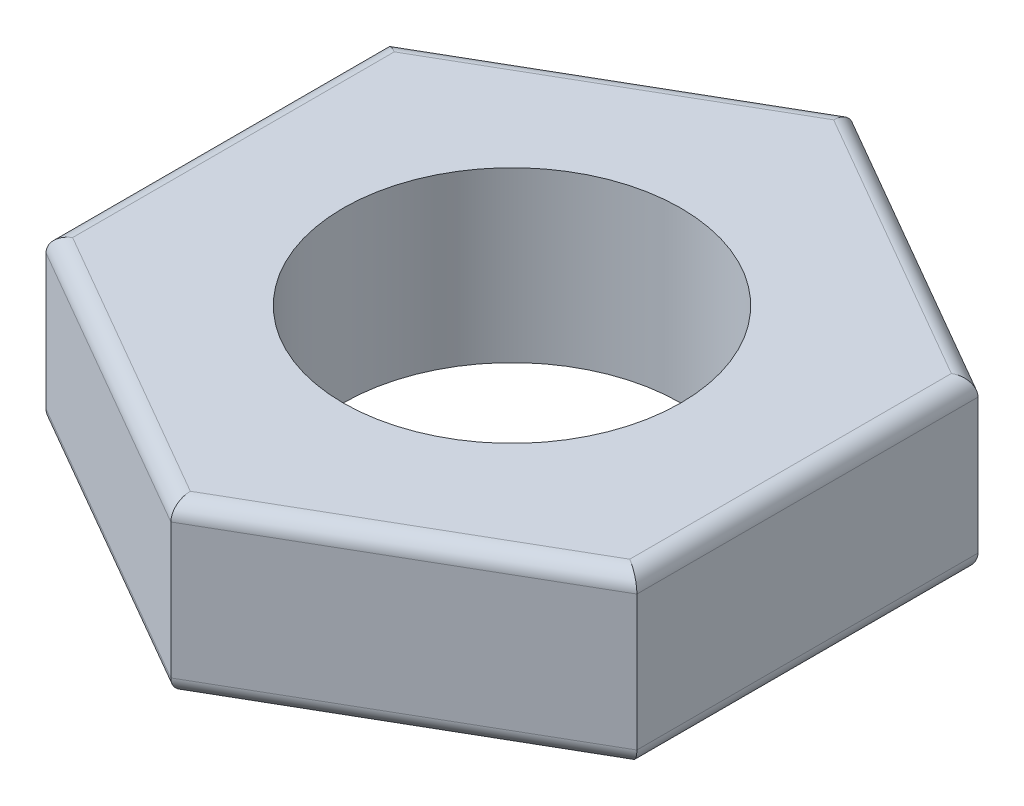
ISO-10303-21;
HEADER;
FILE_DESCRIPTION(('STEP AP214'),'2;1');
FILE_NAME('part.step','',(''),(''),'','','');
FILE_SCHEMA(('AUTOMOTIVE_DESIGN { 1 0 10303 214 1 1 1 1 }'));
ENDSEC;
DATA;
#1=APPLICATION_CONTEXT('core data for automotive mechanical design processes');
#2=APPLICATION_PROTOCOL_DEFINITION('international standard','automotive_design',2000,#1);
#3=PRODUCT_CONTEXT('',#1,'mechanical');
#4=PRODUCT('Part','Part','',(#3));
#5=PRODUCT_RELATED_PRODUCT_CATEGORY('part','',(#4));
#6=PRODUCT_DEFINITION_FORMATION('','',#4);
#7=PRODUCT_DEFINITION_CONTEXT('part definition',#1,'design');
#8=PRODUCT_DEFINITION('design','',#6,#7);
#9=PRODUCT_DEFINITION_SHAPE('','',#8);
#10=(LENGTH_UNIT() NAMED_UNIT(*) SI_UNIT(.MILLI.,.METRE.));
#11=(NAMED_UNIT(*) PLANE_ANGLE_UNIT() SI_UNIT($,.RADIAN.));
#12=(NAMED_UNIT(*) SI_UNIT($,.STERADIAN.) SOLID_ANGLE_UNIT());
#13=UNCERTAINTY_MEASURE_WITH_UNIT(LENGTH_MEASURE(1.E-05),#10,'distance_accuracy_value','');
#14=(GEOMETRIC_REPRESENTATION_CONTEXT(3) GLOBAL_UNCERTAINTY_ASSIGNED_CONTEXT((#13)) GLOBAL_UNIT_ASSIGNED_CONTEXT((#10,
#11,#12)) REPRESENTATION_CONTEXT('',''));
#15=CARTESIAN_POINT('',(0.,0.,0.));
#16=DIRECTION('',(0.,0.,1.));
#17=DIRECTION('',(1.,0.,0.));
#18=AXIS2_PLACEMENT_3D('',#15,#16,#17);
#19=CARTESIAN_POINT('',(3.5,0.,-2.02072594216369));
#20=DIRECTION('',(0.5,0.,-0.866025403784439));
#21=DIRECTION('',(-0.866025403784439,0.,-0.5));
#22=AXIS2_PLACEMENT_3D('',#19,#20,#21);
#23=PLANE('',#22);
#24=DIRECTION('',(0.,1.,0.));
#25=VECTOR('',#24,1.);
#26=CARTESIAN_POINT('',(0.,0.,-4.04145188432738));
#27=LINE('',#26,#25);
#28=CARTESIAN_POINT('',(0.,0.2,-4.04145188432738));
#29=VERTEX_POINT('',#28);
#30=CARTESIAN_POINT('',(0.,1.8,-4.04145188432738));
#31=VERTEX_POINT('',#30);
#32=EDGE_CURVE('E253',#29,#31,#27,.T.);
#33=ORIENTED_EDGE('',*,*,#32,.T.);
#34=DIRECTION('',(-0.866025403784439,0.,-0.5));
#35=VECTOR('',#34,1.);
#36=CARTESIAN_POINT('',(3.5,1.8,-2.02072594216369));
#37=LINE('',#36,#35);
#38=CARTESIAN_POINT('',(3.5,1.8,-2.02072594216369));
#39=VERTEX_POINT('',#38);
#40=EDGE_CURVE('E157',#31,#39,#37,.F.);
#41=ORIENTED_EDGE('',*,*,#40,.T.);
#42=DIRECTION('',(0.,1.,0.));
#43=VECTOR('',#42,1.);
#44=CARTESIAN_POINT('',(3.5,0.,-2.02072594216369));
#45=LINE('',#44,#43);
#46=CARTESIAN_POINT('',(3.5,0.2,-2.02072594216369));
#47=VERTEX_POINT('',#46);
#48=EDGE_CURVE('E154',#47,#39,#45,.T.);
#49=ORIENTED_EDGE('',*,*,#48,.F.);
#50=DIRECTION('',(-0.866025403784439,0.,-0.5));
#51=VECTOR('',#50,1.);
#52=CARTESIAN_POINT('',(0.,0.2,-4.04145188432738));
#53=LINE('',#52,#51);
#54=EDGE_CURVE('E213',#47,#29,#53,.T.);
#55=ORIENTED_EDGE('',*,*,#54,.T.);
#56=EDGE_LOOP('',(#33,#41,#49,#55));
#57=FACE_BOUND('',#56,.T.);
#58=ADVANCED_FACE('F39',(#57),#23,.T.);
#59=CARTESIAN_POINT('',(3.5,0.,2.02072594216369));
#60=DIRECTION('',(1.,0.,0.));
#61=DIRECTION('',(0.,0.,-1.));
#62=AXIS2_PLACEMENT_3D('',#59,#60,#61);
#63=PLANE('',#62);
#64=ORIENTED_EDGE('',*,*,#48,.T.);
#65=DIRECTION('',(0.,0.,-1.));
#66=VECTOR('',#65,1.);
#67=CARTESIAN_POINT('',(3.5,1.8,2.02072594216369));
#68=LINE('',#67,#66);
#69=CARTESIAN_POINT('',(3.5,1.8,2.02072594216369));
#70=VERTEX_POINT('',#69);
#71=EDGE_CURVE('E198',#39,#70,#68,.F.);
#72=ORIENTED_EDGE('',*,*,#71,.T.);
#73=DIRECTION('',(0.,1.,0.));
#74=VECTOR('',#73,1.);
#75=CARTESIAN_POINT('',(3.5,0.,2.02072594216369));
#76=LINE('',#75,#74);
#77=CARTESIAN_POINT('',(3.5,0.2,2.02072594216369));
#78=VERTEX_POINT('',#77);
#79=EDGE_CURVE('E265',#78,#70,#76,.T.);
#80=ORIENTED_EDGE('',*,*,#79,.F.);
#81=DIRECTION('',(0.,0.,-1.));
#82=VECTOR('',#81,1.);
#83=CARTESIAN_POINT('',(3.5,0.2,-2.02072594216369));
#84=LINE('',#83,#82);
#85=EDGE_CURVE('E204',#78,#47,#84,.T.);
#86=ORIENTED_EDGE('',*,*,#85,.T.);
#87=EDGE_LOOP('',(#64,#72,#80,#86));
#88=FACE_BOUND('',#87,.T.);
#89=ADVANCED_FACE('F287',(#88),#63,.T.);
#90=CARTESIAN_POINT('',(0.,0.,4.04145188432738));
#91=DIRECTION('',(0.5,0.,0.866025403784439));
#92=DIRECTION('',(0.866025403784439,0.,-0.5));
#93=AXIS2_PLACEMENT_3D('',#90,#91,#92);
#94=PLANE('',#93);
#95=ORIENTED_EDGE('',*,*,#79,.T.);
#96=DIRECTION('',(0.866025403784439,0.,-0.5));
#97=VECTOR('',#96,1.);
#98=CARTESIAN_POINT('',(0.,1.8,4.04145188432738));
#99=LINE('',#98,#97);
#100=CARTESIAN_POINT('',(0.,1.8,4.04145188432738));
#101=VERTEX_POINT('',#100);
#102=EDGE_CURVE('E239',#70,#101,#99,.F.);
#103=ORIENTED_EDGE('',*,*,#102,.T.);
#104=DIRECTION('',(0.,1.,0.));
#105=VECTOR('',#104,1.);
#106=CARTESIAN_POINT('',(0.,0.,4.04145188432738));
#107=LINE('',#106,#105);
#108=CARTESIAN_POINT('',(0.,0.2,4.04145188432738));
#109=VERTEX_POINT('',#108);
#110=EDGE_CURVE('E263',#109,#101,#107,.T.);
#111=ORIENTED_EDGE('',*,*,#110,.F.);
#112=DIRECTION('',(0.866025403784439,0.,-0.5));
#113=VECTOR('',#112,1.);
#114=CARTESIAN_POINT('',(3.5,0.2,2.02072594216369));
#115=LINE('',#114,#113);
#116=EDGE_CURVE('E242',#109,#78,#115,.T.);
#117=ORIENTED_EDGE('',*,*,#116,.T.);
#118=EDGE_LOOP('',(#95,#103,#111,#117));
#119=FACE_BOUND('',#118,.T.);
#120=ADVANCED_FACE('F294',(#119),#94,.T.);
#121=CARTESIAN_POINT('',(-3.5,0.,2.02072594216369));
#122=DIRECTION('',(-0.5,0.,0.866025403784439));
#123=DIRECTION('',(0.866025403784439,0.,0.5));
#124=AXIS2_PLACEMENT_3D('',#121,#122,#123);
#125=PLANE('',#124);
#126=ORIENTED_EDGE('',*,*,#110,.T.);
#127=DIRECTION('',(0.866025403784439,0.,0.5));
#128=VECTOR('',#127,1.);
#129=CARTESIAN_POINT('',(-3.5,1.8,2.02072594216369));
#130=LINE('',#129,#128);
#131=CARTESIAN_POINT('',(-3.5,1.8,2.02072594216369));
#132=VERTEX_POINT('',#131);
#133=EDGE_CURVE('E208',#101,#132,#130,.F.);
#134=ORIENTED_EDGE('',*,*,#133,.T.);
#135=DIRECTION('',(0.,1.,0.));
#136=VECTOR('',#135,1.);
#137=CARTESIAN_POINT('',(-3.5,0.,2.02072594216369));
#138=LINE('',#137,#136);
#139=CARTESIAN_POINT('',(-3.5,0.2,2.02072594216369));
#140=VERTEX_POINT('',#139);
#141=EDGE_CURVE('E260',#140,#132,#138,.T.);
#142=ORIENTED_EDGE('',*,*,#141,.F.);
#143=DIRECTION('',(0.866025403784439,0.,0.5));
#144=VECTOR('',#143,1.);
#145=CARTESIAN_POINT('',(0.,0.2,4.04145188432738));
#146=LINE('',#145,#144);
#147=EDGE_CURVE('E234',#140,#109,#146,.T.);
#148=ORIENTED_EDGE('',*,*,#147,.T.);
#149=EDGE_LOOP('',(#126,#134,#142,#148));
#150=FACE_BOUND('',#149,.T.);
#151=ADVANCED_FACE('F346',(#150),#125,.T.);
#152=CARTESIAN_POINT('',(-3.5,0.,-2.02072594216369));
#153=DIRECTION('',(-1.,0.,0.));
#154=DIRECTION('',(0.,0.,1.));
#155=AXIS2_PLACEMENT_3D('',#152,#153,#154);
#156=PLANE('',#155);
#157=ORIENTED_EDGE('',*,*,#141,.T.);
#158=DIRECTION('',(0.,0.,1.));
#159=VECTOR('',#158,1.);
#160=CARTESIAN_POINT('',(-3.5,1.8,-2.02072594216369));
#161=LINE('',#160,#159);
#162=CARTESIAN_POINT('',(-3.5,1.8,-2.02072594216369));
#163=VERTEX_POINT('',#162);
#164=EDGE_CURVE('E206',#132,#163,#161,.F.);
#165=ORIENTED_EDGE('',*,*,#164,.T.);
#166=DIRECTION('',(0.,1.,0.));
#167=VECTOR('',#166,1.);
#168=CARTESIAN_POINT('',(-3.5,0.,-2.02072594216369));
#169=LINE('',#168,#167);
#170=CARTESIAN_POINT('',(-3.5,0.2,-2.02072594216369));
#171=VERTEX_POINT('',#170);
#172=EDGE_CURVE('E256',#171,#163,#169,.T.);
#173=ORIENTED_EDGE('',*,*,#172,.F.);
#174=DIRECTION('',(0.,0.,1.));
#175=VECTOR('',#174,1.);
#176=CARTESIAN_POINT('',(-3.5,0.2,2.02072594216369));
#177=LINE('',#176,#175);
#178=EDGE_CURVE('E203',#171,#140,#177,.T.);
#179=ORIENTED_EDGE('',*,*,#178,.T.);
#180=EDGE_LOOP('',(#157,#165,#173,#179));
#181=FACE_BOUND('',#180,.T.);
#182=ADVANCED_FACE('F282',(#181),#156,.T.);
#183=CARTESIAN_POINT('',(0.,0.,-4.04145188432738));
#184=DIRECTION('',(-0.5,0.,-0.866025403784439));
#185=DIRECTION('',(-0.866025403784439,0.,0.5));
#186=AXIS2_PLACEMENT_3D('',#183,#184,#185);
#187=PLANE('',#186);
#188=ORIENTED_EDGE('',*,*,#172,.T.);
#189=DIRECTION('',(-0.866025403784439,0.,0.5));
#190=VECTOR('',#189,1.);
#191=CARTESIAN_POINT('',(0.,1.8,-4.04145188432738));
#192=LINE('',#191,#190);
#193=EDGE_CURVE('E218',#163,#31,#192,.F.);
#194=ORIENTED_EDGE('',*,*,#193,.T.);
#195=ORIENTED_EDGE('',*,*,#32,.F.);
#196=DIRECTION('',(-0.866025403784439,0.,0.5));
#197=VECTOR('',#196,1.);
#198=CARTESIAN_POINT('',(-3.5,0.2,-2.02072594216369));
#199=LINE('',#198,#197);
#200=EDGE_CURVE('E216',#29,#171,#199,.T.);
#201=ORIENTED_EDGE('',*,*,#200,.T.);
#202=EDGE_LOOP('',(#188,#194,#195,#201));
#203=FACE_BOUND('',#202,.T.);
#204=ADVANCED_FACE('F275',(#203),#187,.T.);
#205=CARTESIAN_POINT('',(0.,0.,0.));
#206=DIRECTION('',(0.,1.,0.));
#207=DIRECTION('',(0.,0.,1.));
#208=AXIS2_PLACEMENT_3D('',#205,#206,#207);
#209=PLANE('',#208);
#210=DIRECTION('',(0.,0.,-1.));
#211=VECTOR('',#210,1.);
#212=CARTESIAN_POINT('',(3.3,0.,2.02072594216369));
#213=LINE('',#212,#211);
#214=CARTESIAN_POINT('',(3.3,0.,-1.90525588832577));
#215=VERTEX_POINT('',#214);
#216=CARTESIAN_POINT('',(3.3,0.,1.90525588832576));
#217=VERTEX_POINT('',#216);
#218=EDGE_CURVE('E63',#215,#217,#213,.F.);
#219=ORIENTED_EDGE('',*,*,#218,.T.);
#220=DIRECTION('',(0.866025403784439,0.,-0.5));
#221=VECTOR('',#220,1.);
#222=CARTESIAN_POINT('',(-0.0999999999999996,0.,3.86824680357049));
#223=LINE('',#222,#221);
#224=CARTESIAN_POINT('',(0.,0.,3.81051177665153));
#225=VERTEX_POINT('',#224);
#226=EDGE_CURVE('E11',#217,#225,#223,.F.);
#227=ORIENTED_EDGE('',*,*,#226,.T.);
#228=DIRECTION('',(0.866025403784439,0.,0.5));
#229=VECTOR('',#228,1.);
#230=CARTESIAN_POINT('',(-3.4,0.,1.8475208614068));
#231=LINE('',#230,#229);
#232=CARTESIAN_POINT('',(-3.3,0.,1.90525588832576));
#233=VERTEX_POINT('',#232);
#234=EDGE_CURVE('E48',#225,#233,#231,.F.);
#235=ORIENTED_EDGE('',*,*,#234,.T.);
#236=DIRECTION('',(0.,0.,1.));
#237=VECTOR('',#236,1.);
#238=CARTESIAN_POINT('',(-3.3,0.,-2.02072594216369));
#239=LINE('',#238,#237);
#240=CARTESIAN_POINT('',(-3.3,0.,-1.90525588832576));
#241=VERTEX_POINT('',#240);
#242=EDGE_CURVE('E224',#233,#241,#239,.F.);
#243=ORIENTED_EDGE('',*,*,#242,.T.);
#244=DIRECTION('',(-0.866025403784439,0.,0.5));
#245=VECTOR('',#244,1.);
#246=CARTESIAN_POINT('',(0.100000000000004,0.,-3.86824680357049));
#247=LINE('',#246,#245);
#248=CARTESIAN_POINT('',(0.,0.,-3.81051177665153));
#249=VERTEX_POINT('',#248);
#250=EDGE_CURVE('E220',#241,#249,#247,.F.);
#251=ORIENTED_EDGE('',*,*,#250,.T.);
#252=DIRECTION('',(-0.866025403784439,0.,-0.5));
#253=VECTOR('',#252,1.);
#254=CARTESIAN_POINT('',(3.4,0.,-1.8475208614068));
#255=LINE('',#254,#253);
#256=EDGE_CURVE('E222',#249,#215,#255,.F.);
#257=ORIENTED_EDGE('',*,*,#256,.T.);
#258=EDGE_LOOP('',(#219,#227,#235,#243,#251,#257));
#259=FACE_BOUND('',#258,.T.);
#260=CARTESIAN_POINT('',(0.,0.,0.));
#261=DIRECTION('',(0.,-1.,0.));
#262=DIRECTION('',(0.,0.,-1.));
#263=AXIS2_PLACEMENT_3D('',#260,#261,#262);
#264=CIRCLE('',#263,1.99999999999999);
#265=CARTESIAN_POINT('',(0.,0.,-1.99999999999999));
#266=VERTEX_POINT('',#265);
#267=EDGE_CURVE('E160',#266,#266,#264,.T.);
#268=ORIENTED_EDGE('',*,*,#267,.F.);
#269=EDGE_LOOP('',(#268));
#270=FACE_BOUND('',#269,.T.);
#271=ADVANCED_FACE('F226',(#259,#270),#209,.F.);
#272=CARTESIAN_POINT('',(0.,2.,0.));
#273=DIRECTION('',(0.,1.,0.));
#274=DIRECTION('',(0.,0.,1.));
#275=AXIS2_PLACEMENT_3D('',#272,#273,#274);
#276=PLANE('',#275);
#277=DIRECTION('',(0.866025403784439,0.,0.5));
#278=VECTOR('',#277,1.);
#279=CARTESIAN_POINT('',(-1.65,2.,2.85788383248865));
#280=LINE('',#279,#278);
#281=CARTESIAN_POINT('',(-3.3,2.,1.90525588832576));
#282=VERTEX_POINT('',#281);
#283=CARTESIAN_POINT('',(0.,2.,3.81051177665153));
#284=VERTEX_POINT('',#283);
#285=EDGE_CURVE('E249',#282,#284,#280,.T.);
#286=ORIENTED_EDGE('',*,*,#285,.T.);
#287=DIRECTION('',(0.866025403784439,0.,-0.5));
#288=VECTOR('',#287,1.);
#289=CARTESIAN_POINT('',(1.65,2.,2.85788383248865));
#290=LINE('',#289,#288);
#291=CARTESIAN_POINT('',(3.3,2.,1.90525588832576));
#292=VERTEX_POINT('',#291);
#293=EDGE_CURVE('E247',#284,#292,#290,.T.);
#294=ORIENTED_EDGE('',*,*,#293,.T.);
#295=DIRECTION('',(0.,0.,-1.));
#296=VECTOR('',#295,1.);
#297=CARTESIAN_POINT('',(3.3,2.,0.));
#298=LINE('',#297,#296);
#299=CARTESIAN_POINT('',(3.3,2.,-1.90525588832577));
#300=VERTEX_POINT('',#299);
#301=EDGE_CURVE('E138',#292,#300,#298,.T.);
#302=ORIENTED_EDGE('',*,*,#301,.T.);
#303=DIRECTION('',(-0.866025403784439,0.,-0.5));
#304=VECTOR('',#303,1.);
#305=CARTESIAN_POINT('',(1.65,2.,-2.85788383248865));
#306=LINE('',#305,#304);
#307=CARTESIAN_POINT('',(0.,2.,-3.81051177665153));
#308=VERTEX_POINT('',#307);
#309=EDGE_CURVE('E130',#300,#308,#306,.T.);
#310=ORIENTED_EDGE('',*,*,#309,.T.);
#311=DIRECTION('',(-0.866025403784439,0.,0.5));
#312=VECTOR('',#311,1.);
#313=CARTESIAN_POINT('',(-1.65,2.,-2.85788383248864));
#314=LINE('',#313,#312);
#315=CARTESIAN_POINT('',(-3.3,2.,-1.90525588832576));
#316=VERTEX_POINT('',#315);
#317=EDGE_CURVE('E134',#308,#316,#314,.T.);
#318=ORIENTED_EDGE('',*,*,#317,.T.);
#319=DIRECTION('',(0.,0.,1.));
#320=VECTOR('',#319,1.);
#321=CARTESIAN_POINT('',(-3.3,2.,0.));
#322=LINE('',#321,#320);
#323=EDGE_CURVE('E143',#316,#282,#322,.T.);
#324=ORIENTED_EDGE('',*,*,#323,.T.);
#325=EDGE_LOOP('',(#286,#294,#302,#310,#318,#324));
#326=FACE_BOUND('',#325,.T.);
#327=CARTESIAN_POINT('',(0.,2.,0.));
#328=DIRECTION('',(0.,-1.,0.));
#329=DIRECTION('',(0.,0.,-1.));
#330=AXIS2_PLACEMENT_3D('',#327,#328,#329);
#331=CIRCLE('',#330,1.99999999999999);
#332=CARTESIAN_POINT('',(0.,2.,-1.99999999999999));
#333=VERTEX_POINT('',#332);
#334=EDGE_CURVE('E257',#333,#333,#331,.T.);
#335=ORIENTED_EDGE('',*,*,#334,.T.);
#336=EDGE_LOOP('',(#335));
#337=FACE_BOUND('',#336,.T.);
#338=ADVANCED_FACE('F132',(#326,#337),#276,.T.);
#339=CARTESIAN_POINT('',(0.,0.,0.));
#340=DIRECTION('',(0.,-1.,0.));
#341=DIRECTION('',(0.,0.,-1.));
#342=AXIS2_PLACEMENT_3D('',#339,#340,#341);
#343=CYLINDRICAL_SURFACE('',#342,1.99999999999999);
#344=ORIENTED_EDGE('',*,*,#334,.F.);
#345=EDGE_LOOP('',(#344));
#346=FACE_BOUND('',#345,.T.);
#347=ORIENTED_EDGE('',*,*,#267,.T.);
#348=EDGE_LOOP('',(#347));
#349=FACE_BOUND('',#348,.T.);
#350=ADVANCED_FACE('F273',(#346,#349),#343,.F.);
#351=CARTESIAN_POINT('',(-1.65,1.8,-2.85788383248865));
#352=DIRECTION('',(-0.866025403784439,0.,0.5));
#353=DIRECTION('',(0.5,0.,0.866025403784439));
#354=AXIS2_PLACEMENT_3D('',#351,#352,#353);
#355=CYLINDRICAL_SURFACE('',#354,0.2);
#356=CARTESIAN_POINT('',(0.,1.8,-3.81051177665153));
#357=DIRECTION('',(-1.,0.,0.));
#358=DIRECTION('',(0.,0.,1.));
#359=AXIS2_PLACEMENT_3D('',#356,#357,#358);
#360=ELLIPSE('',#359,0.23094010767585,0.2);
#361=EDGE_CURVE('E149',#31,#308,#360,.F.);
#362=ORIENTED_EDGE('',*,*,#361,.F.);
#363=ORIENTED_EDGE('',*,*,#193,.F.);
#364=CARTESIAN_POINT('',(-3.3,1.8,-1.90525588832576));
#365=DIRECTION('',(-0.5,0.,0.866025403784438));
#366=DIRECTION('',(-0.866025403784439,0.,-0.5));
#367=AXIS2_PLACEMENT_3D('',#364,#365,#366);
#368=ELLIPSE('',#367,0.23094010767585,0.2);
#369=EDGE_CURVE('E152',#316,#163,#368,.T.);
#370=ORIENTED_EDGE('',*,*,#369,.F.);
#371=ORIENTED_EDGE('',*,*,#317,.F.);
#372=EDGE_LOOP('',(#362,#363,#370,#371));
#373=FACE_BOUND('',#372,.T.);
#374=ADVANCED_FACE('F147',(#373),#355,.T.);
#375=CARTESIAN_POINT('',(-3.3,1.8,0.));
#376=DIRECTION('',(0.,0.,1.));
#377=DIRECTION('',(1.,0.,0.));
#378=AXIS2_PLACEMENT_3D('',#375,#376,#377);
#379=CYLINDRICAL_SURFACE('',#378,0.2);
#380=ORIENTED_EDGE('',*,*,#369,.T.);
#381=ORIENTED_EDGE('',*,*,#164,.F.);
#382=CARTESIAN_POINT('',(-3.3,1.8,1.90525588832576));
#383=DIRECTION('',(0.5,0.,0.866025403784439));
#384=DIRECTION('',(-0.866025403784439,0.,0.5));
#385=AXIS2_PLACEMENT_3D('',#382,#383,#384);
#386=ELLIPSE('',#385,0.23094010767585,0.2);
#387=EDGE_CURVE('E158',#282,#132,#386,.T.);
#388=ORIENTED_EDGE('',*,*,#387,.F.);
#389=ORIENTED_EDGE('',*,*,#323,.F.);
#390=EDGE_LOOP('',(#380,#381,#388,#389));
#391=FACE_BOUND('',#390,.T.);
#392=ADVANCED_FACE('F309',(#391),#379,.T.);
#393=CARTESIAN_POINT('',(1.65,1.8,-2.85788383248865));
#394=DIRECTION('',(-0.866025403784439,0.,-0.5));
#395=DIRECTION('',(-0.5,0.,0.866025403784439));
#396=AXIS2_PLACEMENT_3D('',#393,#394,#395);
#397=CYLINDRICAL_SURFACE('',#396,0.2);
#398=ORIENTED_EDGE('',*,*,#361,.T.);
#399=ORIENTED_EDGE('',*,*,#309,.F.);
#400=CARTESIAN_POINT('',(3.3,1.8,-1.90525588832577));
#401=DIRECTION('',(-0.5,0.,-0.866025403784439));
#402=DIRECTION('',(-0.866025403784439,0.,0.5));
#403=AXIS2_PLACEMENT_3D('',#400,#401,#402);
#404=ELLIPSE('',#403,0.23094010767585,0.2);
#405=EDGE_CURVE('E163',#39,#300,#404,.F.);
#406=ORIENTED_EDGE('',*,*,#405,.F.);
#407=ORIENTED_EDGE('',*,*,#40,.F.);
#408=EDGE_LOOP('',(#398,#399,#406,#407));
#409=FACE_BOUND('',#408,.T.);
#410=ADVANCED_FACE('F156',(#409),#397,.T.);
#411=CARTESIAN_POINT('',(-1.65,1.8,2.85788383248865));
#412=DIRECTION('',(0.866025403784439,0.,0.5));
#413=DIRECTION('',(0.5,0.,-0.866025403784439));
#414=AXIS2_PLACEMENT_3D('',#411,#412,#413);
#415=CYLINDRICAL_SURFACE('',#414,0.2);
#416=ORIENTED_EDGE('',*,*,#387,.T.);
#417=ORIENTED_EDGE('',*,*,#133,.F.);
#418=CARTESIAN_POINT('',(0.,1.8,3.81051177665153));
#419=DIRECTION('',(1.,0.,0.));
#420=DIRECTION('',(0.,0.,1.));
#421=AXIS2_PLACEMENT_3D('',#418,#419,#420);
#422=ELLIPSE('',#421,0.23094010767585,0.2);
#423=EDGE_CURVE('E187',#284,#101,#422,.T.);
#424=ORIENTED_EDGE('',*,*,#423,.F.);
#425=ORIENTED_EDGE('',*,*,#285,.F.);
#426=EDGE_LOOP('',(#416,#417,#424,#425));
#427=FACE_BOUND('',#426,.T.);
#428=ADVANCED_FACE('F303',(#427),#415,.T.);
#429=CARTESIAN_POINT('',(3.3,1.8,0.));
#430=DIRECTION('',(0.,0.,-1.));
#431=DIRECTION('',(-1.,0.,0.));
#432=AXIS2_PLACEMENT_3D('',#429,#430,#431);
#433=CYLINDRICAL_SURFACE('',#432,0.2);
#434=ORIENTED_EDGE('',*,*,#405,.T.);
#435=ORIENTED_EDGE('',*,*,#301,.F.);
#436=CARTESIAN_POINT('',(3.3,1.8,1.90525588832576));
#437=DIRECTION('',(0.5,0.,-0.866025403784439));
#438=DIRECTION('',(-0.866025403784439,0.,-0.5));
#439=AXIS2_PLACEMENT_3D('',#436,#437,#438);
#440=ELLIPSE('',#439,0.23094010767585,0.2);
#441=EDGE_CURVE('E182',#70,#292,#440,.F.);
#442=ORIENTED_EDGE('',*,*,#441,.F.);
#443=ORIENTED_EDGE('',*,*,#71,.F.);
#444=EDGE_LOOP('',(#434,#435,#442,#443));
#445=FACE_BOUND('',#444,.T.);
#446=ADVANCED_FACE('F197',(#445),#433,.T.);
#447=CARTESIAN_POINT('',(1.65,1.8,2.85788383248865));
#448=DIRECTION('',(0.866025403784439,0.,-0.5));
#449=DIRECTION('',(-0.5,0.,-0.866025403784439));
#450=AXIS2_PLACEMENT_3D('',#447,#448,#449);
#451=CYLINDRICAL_SURFACE('',#450,0.2);
#452=ORIENTED_EDGE('',*,*,#423,.T.);
#453=ORIENTED_EDGE('',*,*,#102,.F.);
#454=ORIENTED_EDGE('',*,*,#441,.T.);
#455=ORIENTED_EDGE('',*,*,#293,.F.);
#456=EDGE_LOOP('',(#452,#453,#454,#455));
#457=FACE_BOUND('',#456,.T.);
#458=ADVANCED_FACE('F298',(#457),#451,.T.);
#459=CARTESIAN_POINT('',(0.100000000000004,0.2,-3.86824680357049));
#460=DIRECTION('',(0.866025403784439,0.,-0.5));
#461=DIRECTION('',(-0.5,0.,-0.866025403784439));
#462=AXIS2_PLACEMENT_3D('',#459,#460,#461);
#463=CYLINDRICAL_SURFACE('',#462,0.2);
#464=CARTESIAN_POINT('',(0.,0.2,-3.81051177665153));
#465=DIRECTION('',(1.,0.,0.));
#466=DIRECTION('',(0.,0.,-1.));
#467=AXIS2_PLACEMENT_3D('',#464,#465,#466);
#468=ELLIPSE('',#467,0.23094010767585,0.2);
#469=EDGE_CURVE('E175',#249,#29,#468,.T.);
#470=ORIENTED_EDGE('',*,*,#469,.F.);
#471=ORIENTED_EDGE('',*,*,#250,.F.);
#472=CARTESIAN_POINT('',(-3.3,0.2,-1.90525588832576));
#473=DIRECTION('',(0.5,0.,-0.866025403784438));
#474=DIRECTION('',(0.866025403784439,0.,0.5));
#475=AXIS2_PLACEMENT_3D('',#472,#473,#474);
#476=ELLIPSE('',#475,0.23094010767585,0.2);
#477=EDGE_CURVE('E43',#171,#241,#476,.F.);
#478=ORIENTED_EDGE('',*,*,#477,.F.);
#479=ORIENTED_EDGE('',*,*,#200,.F.);
#480=EDGE_LOOP('',(#470,#471,#478,#479));
#481=FACE_BOUND('',#480,.T.);
#482=ADVANCED_FACE('F41',(#481),#463,.T.);
#483=CARTESIAN_POINT('',(-3.3,0.2,-2.02072594216369));
#484=DIRECTION('',(0.,0.,-1.));
#485=DIRECTION('',(-1.,0.,0.));
#486=AXIS2_PLACEMENT_3D('',#483,#484,#485);
#487=CYLINDRICAL_SURFACE('',#486,0.2);
#488=ORIENTED_EDGE('',*,*,#477,.T.);
#489=ORIENTED_EDGE('',*,*,#242,.F.);
#490=CARTESIAN_POINT('',(-3.3,0.2,1.90525588832576));
#491=DIRECTION('',(-0.5,0.,-0.866025403784439));
#492=DIRECTION('',(0.866025403784439,0.,-0.5));
#493=AXIS2_PLACEMENT_3D('',#490,#491,#492);
#494=ELLIPSE('',#493,0.23094010767585,0.2);
#495=EDGE_CURVE('E173',#140,#233,#494,.F.);
#496=ORIENTED_EDGE('',*,*,#495,.F.);
#497=ORIENTED_EDGE('',*,*,#178,.F.);
#498=EDGE_LOOP('',(#488,#489,#496,#497));
#499=FACE_BOUND('',#498,.T.);
#500=ADVANCED_FACE('F231',(#499),#487,.T.);
#501=CARTESIAN_POINT('',(3.4,0.2,-1.8475208614068));
#502=DIRECTION('',(0.866025403784439,0.,0.5));
#503=DIRECTION('',(0.5,0.,-0.866025403784439));
#504=AXIS2_PLACEMENT_3D('',#501,#502,#503);
#505=CYLINDRICAL_SURFACE('',#504,0.2);
#506=ORIENTED_EDGE('',*,*,#469,.T.);
#507=ORIENTED_EDGE('',*,*,#54,.F.);
#508=CARTESIAN_POINT('',(3.3,0.2,-1.90525588832577));
#509=DIRECTION('',(0.5,0.,0.866025403784439));
#510=DIRECTION('',(0.866025403784439,0.,-0.5));
#511=AXIS2_PLACEMENT_3D('',#508,#509,#510);
#512=ELLIPSE('',#511,0.23094010767585,0.2);
#513=EDGE_CURVE('E170',#215,#47,#512,.T.);
#514=ORIENTED_EDGE('',*,*,#513,.F.);
#515=ORIENTED_EDGE('',*,*,#256,.F.);
#516=EDGE_LOOP('',(#506,#507,#514,#515));
#517=FACE_BOUND('',#516,.T.);
#518=ADVANCED_FACE('F324',(#517),#505,.T.);
#519=CARTESIAN_POINT('',(-3.4,0.2,1.8475208614068));
#520=DIRECTION('',(-0.866025403784439,0.,-0.5));
#521=DIRECTION('',(-0.5,0.,0.866025403784439));
#522=AXIS2_PLACEMENT_3D('',#519,#520,#521);
#523=CYLINDRICAL_SURFACE('',#522,0.2);
#524=ORIENTED_EDGE('',*,*,#495,.T.);
#525=ORIENTED_EDGE('',*,*,#234,.F.);
#526=CARTESIAN_POINT('',(0.,0.2,3.81051177665153));
#527=DIRECTION('',(-1.,0.,0.));
#528=DIRECTION('',(0.,0.,-1.));
#529=AXIS2_PLACEMENT_3D('',#526,#527,#528);
#530=ELLIPSE('',#529,0.23094010767585,0.2);
#531=EDGE_CURVE('E56',#109,#225,#530,.F.);
#532=ORIENTED_EDGE('',*,*,#531,.F.);
#533=ORIENTED_EDGE('',*,*,#147,.F.);
#534=EDGE_LOOP('',(#524,#525,#532,#533));
#535=FACE_BOUND('',#534,.T.);
#536=ADVANCED_FACE('F233',(#535),#523,.T.);
#537=CARTESIAN_POINT('',(3.3,0.2,2.02072594216369));
#538=DIRECTION('',(0.,0.,1.));
#539=DIRECTION('',(1.,0.,0.));
#540=AXIS2_PLACEMENT_3D('',#537,#538,#539);
#541=CYLINDRICAL_SURFACE('',#540,0.2);
#542=ORIENTED_EDGE('',*,*,#513,.T.);
#543=ORIENTED_EDGE('',*,*,#85,.F.);
#544=CARTESIAN_POINT('',(3.3,0.2,1.90525588832576));
#545=DIRECTION('',(-0.5,0.,0.866025403784439));
#546=DIRECTION('',(0.866025403784439,0.,0.5));
#547=AXIS2_PLACEMENT_3D('',#544,#545,#546);
#548=ELLIPSE('',#547,0.23094010767585,0.2);
#549=EDGE_CURVE('E167',#217,#78,#548,.T.);
#550=ORIENTED_EDGE('',*,*,#549,.F.);
#551=ORIENTED_EDGE('',*,*,#218,.F.);
#552=EDGE_LOOP('',(#542,#543,#550,#551));
#553=FACE_BOUND('',#552,.T.);
#554=ADVANCED_FACE('F318',(#553),#541,.T.);
#555=CARTESIAN_POINT('',(-0.0999999999999995,0.2,3.86824680357049));
#556=DIRECTION('',(-0.866025403784439,0.,0.5));
#557=DIRECTION('',(0.5,0.,0.866025403784439));
#558=AXIS2_PLACEMENT_3D('',#555,#556,#557);
#559=CYLINDRICAL_SURFACE('',#558,0.2);
#560=ORIENTED_EDGE('',*,*,#531,.T.);
#561=ORIENTED_EDGE('',*,*,#226,.F.);
#562=ORIENTED_EDGE('',*,*,#549,.T.);
#563=ORIENTED_EDGE('',*,*,#116,.F.);
#564=EDGE_LOOP('',(#560,#561,#562,#563));
#565=FACE_BOUND('',#564,.T.);
#566=ADVANCED_FACE('F315',(#565),#559,.T.);
#567=CLOSED_SHELL('',(#58,#89,#120,#151,#182,#204,#271,#338,#350,#374,#392,#410,#428,#446,#458,
#482,#500,#518,#536,#554,#566));
#568=MANIFOLD_SOLID_BREP('B2',#567);
#569=ADVANCED_BREP_SHAPE_REPRESENTATION('',(#18,#568),#14);
#570=SHAPE_DEFINITION_REPRESENTATION(#9,#569);
ENDSEC;
END-ISO-10303-21;
